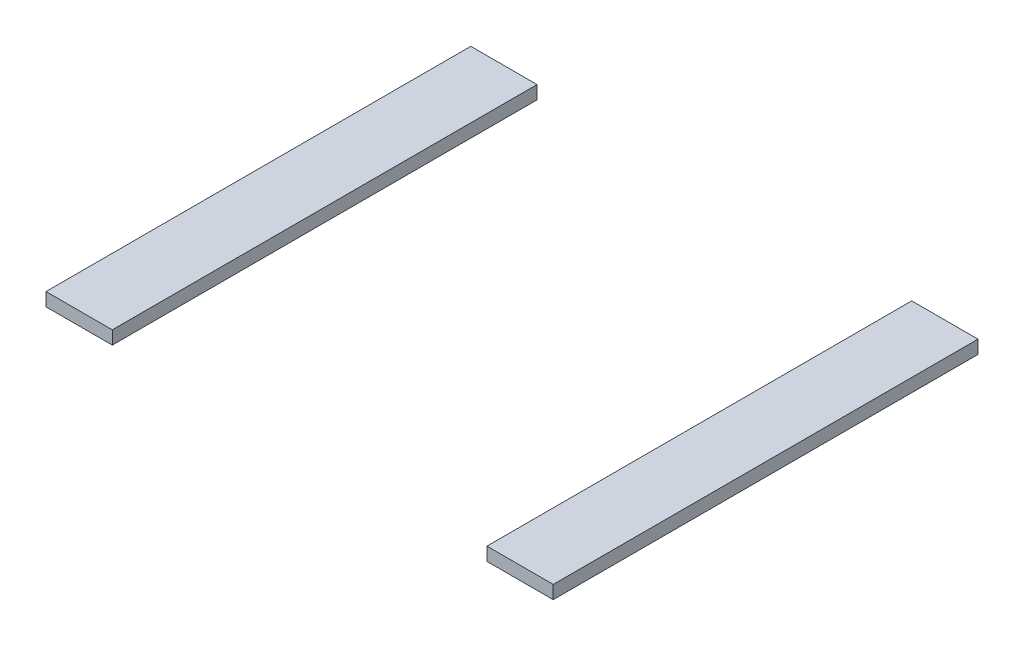
ISO-10303-21;
HEADER;
FILE_DESCRIPTION(('STEP AP214'),'2;1');
FILE_NAME('part.step','',(''),(''),'','','');
FILE_SCHEMA(('AUTOMOTIVE_DESIGN { 1 0 10303 214 1 1 1 1 }'));
ENDSEC;
DATA;
#1=APPLICATION_CONTEXT('core data for automotive mechanical design processes');
#2=APPLICATION_PROTOCOL_DEFINITION('international standard','automotive_design',2000,#1);
#3=PRODUCT_CONTEXT('',#1,'mechanical');
#4=PRODUCT('Part','Part','',(#3));
#5=PRODUCT_RELATED_PRODUCT_CATEGORY('part','',(#4));
#6=PRODUCT_DEFINITION_FORMATION('','',#4);
#7=PRODUCT_DEFINITION_CONTEXT('part definition',#1,'design');
#8=PRODUCT_DEFINITION('design','',#6,#7);
#9=PRODUCT_DEFINITION_SHAPE('','',#8);
#10=(LENGTH_UNIT() NAMED_UNIT(*) SI_UNIT(.MILLI.,.METRE.));
#11=(NAMED_UNIT(*) PLANE_ANGLE_UNIT() SI_UNIT($,.RADIAN.));
#12=(NAMED_UNIT(*) SI_UNIT($,.STERADIAN.) SOLID_ANGLE_UNIT());
#13=UNCERTAINTY_MEASURE_WITH_UNIT(LENGTH_MEASURE(1.E-05),#10,'distance_accuracy_value','');
#14=(GEOMETRIC_REPRESENTATION_CONTEXT(3) GLOBAL_UNCERTAINTY_ASSIGNED_CONTEXT((#13)) GLOBAL_UNIT_ASSIGNED_CONTEXT((#10,
#11,#12)) REPRESENTATION_CONTEXT('',''));
#15=CARTESIAN_POINT('',(0.,0.,0.));
#16=DIRECTION('',(0.,0.,1.));
#17=DIRECTION('',(1.,0.,0.));
#18=AXIS2_PLACEMENT_3D('',#15,#16,#17);
#19=CARTESIAN_POINT('',(0.,0.,0.));
#20=DIRECTION('',(0.,0.,-1.));
#21=DIRECTION('',(-1.,0.,0.));
#22=AXIS2_PLACEMENT_3D('',#19,#20,#21);
#23=PLANE('',#22);
#24=DIRECTION('',(0.,-1.,0.));
#25=VECTOR('',#24,1.);
#26=CARTESIAN_POINT('',(-274.804738153521,-24.0406605530446,0.));
#27=LINE('',#26,#25);
#28=CARTESIAN_POINT('',(-274.804738153521,-14.0406605530446,0.));
#29=VERTEX_POINT('',#28);
#30=CARTESIAN_POINT('',(-274.804738153521,-24.0406605530446,0.));
#31=VERTEX_POINT('',#30);
#32=EDGE_CURVE('E98',#29,#31,#27,.T.);
#33=ORIENTED_EDGE('',*,*,#32,.F.);
#34=DIRECTION('',(-1.,0.,0.));
#35=VECTOR('',#34,1.);
#36=CARTESIAN_POINT('',(-274.804738153521,-14.0406605530446,0.));
#37=LINE('',#36,#35);
#38=CARTESIAN_POINT('',(-224.804738153521,-14.0406605530446,0.));
#39=VERTEX_POINT('',#38);
#40=EDGE_CURVE('E109',#39,#29,#37,.T.);
#41=ORIENTED_EDGE('',*,*,#40,.F.);
#42=DIRECTION('',(0.,1.,0.));
#43=VECTOR('',#42,1.);
#44=CARTESIAN_POINT('',(-224.804738153521,-24.0406605530446,0.));
#45=LINE('',#44,#43);
#46=CARTESIAN_POINT('',(-224.804738153521,-24.0406605530446,0.));
#47=VERTEX_POINT('',#46);
#48=EDGE_CURVE('E100',#47,#39,#45,.T.);
#49=ORIENTED_EDGE('',*,*,#48,.F.);
#50=DIRECTION('',(1.,0.,0.));
#51=VECTOR('',#50,1.);
#52=CARTESIAN_POINT('',(-274.804738153521,-24.0406605530446,0.));
#53=LINE('',#52,#51);
#54=EDGE_CURVE('E90',#31,#47,#53,.T.);
#55=ORIENTED_EDGE('',*,*,#54,.F.);
#56=EDGE_LOOP('',(#33,#41,#49,#55));
#57=FACE_BOUND('',#56,.T.);
#58=ADVANCED_FACE('F48',(#57),#23,.T.);
#59=CARTESIAN_POINT('',(-274.804738153521,-14.0406605530446,371.390195135928));
#60=DIRECTION('',(0.,-1.,0.));
#61=DIRECTION('',(1.,0.,0.));
#62=AXIS2_PLACEMENT_3D('',#59,#60,#61);
#63=PLANE('',#62);
#64=DIRECTION('',(0.,0.,-1.));
#65=VECTOR('',#64,1.);
#66=CARTESIAN_POINT('',(-274.804738153521,-14.0406605530446,371.390195135928));
#67=LINE('',#66,#65);
#68=CARTESIAN_POINT('',(-274.804738153521,-14.0406605530446,320.4));
#69=VERTEX_POINT('',#68);
#70=EDGE_CURVE('E103',#69,#29,#67,.T.);
#71=ORIENTED_EDGE('',*,*,#70,.F.);
#72=DIRECTION('',(1.,0.,0.));
#73=VECTOR('',#72,1.);
#74=CARTESIAN_POINT('',(-274.804738153521,-14.0406605530446,320.4));
#75=LINE('',#74,#73);
#76=CARTESIAN_POINT('',(-224.804738153521,-14.0406605530446,320.4));
#77=VERTEX_POINT('',#76);
#78=EDGE_CURVE('E52',#69,#77,#75,.T.);
#79=ORIENTED_EDGE('',*,*,#78,.T.);
#80=DIRECTION('',(0.,0.,-1.));
#81=VECTOR('',#80,1.);
#82=CARTESIAN_POINT('',(-224.804738153521,-14.0406605530446,371.390195135928));
#83=LINE('',#82,#81);
#84=EDGE_CURVE('E112',#77,#39,#83,.T.);
#85=ORIENTED_EDGE('',*,*,#84,.T.);
#86=ORIENTED_EDGE('',*,*,#40,.T.);
#87=EDGE_LOOP('',(#71,#79,#85,#86));
#88=FACE_BOUND('',#87,.T.);
#89=ADVANCED_FACE('F121',(#88),#63,.F.);
#90=CARTESIAN_POINT('',(-224.804738153521,-24.0406605530446,371.390195135928));
#91=DIRECTION('',(-1.,0.,0.));
#92=DIRECTION('',(0.,0.,1.));
#93=AXIS2_PLACEMENT_3D('',#90,#91,#92);
#94=PLANE('',#93);
#95=ORIENTED_EDGE('',*,*,#84,.F.);
#96=DIRECTION('',(0.,-1.,0.));
#97=VECTOR('',#96,1.);
#98=CARTESIAN_POINT('',(-224.804738153521,-24.0406605530446,320.4));
#99=LINE('',#98,#97);
#100=CARTESIAN_POINT('',(-224.804738153521,-24.0406605530446,320.4));
#101=VERTEX_POINT('',#100);
#102=EDGE_CURVE('E118',#77,#101,#99,.T.);
#103=ORIENTED_EDGE('',*,*,#102,.T.);
#104=DIRECTION('',(0.,0.,-1.));
#105=VECTOR('',#104,1.);
#106=CARTESIAN_POINT('',(-224.804738153521,-24.0406605530446,371.390195135928));
#107=LINE('',#106,#105);
#108=EDGE_CURVE('E94',#101,#47,#107,.T.);
#109=ORIENTED_EDGE('',*,*,#108,.T.);
#110=ORIENTED_EDGE('',*,*,#48,.T.);
#111=EDGE_LOOP('',(#95,#103,#109,#110));
#112=FACE_BOUND('',#111,.T.);
#113=ADVANCED_FACE('F117',(#112),#94,.F.);
#114=CARTESIAN_POINT('',(-274.804738153521,-24.0406605530446,371.390195135928));
#115=DIRECTION('',(0.,1.,0.));
#116=DIRECTION('',(-1.,0.,0.));
#117=AXIS2_PLACEMENT_3D('',#114,#115,#116);
#118=PLANE('',#117);
#119=ORIENTED_EDGE('',*,*,#108,.F.);
#120=DIRECTION('',(-1.,0.,0.));
#121=VECTOR('',#120,1.);
#122=CARTESIAN_POINT('',(-274.804738153521,-24.0406605530446,320.4));
#123=LINE('',#122,#121);
#124=CARTESIAN_POINT('',(-274.804738153521,-24.0406605530446,320.4));
#125=VERTEX_POINT('',#124);
#126=EDGE_CURVE('E57',#101,#125,#123,.T.);
#127=ORIENTED_EDGE('',*,*,#126,.T.);
#128=DIRECTION('',(0.,0.,-1.));
#129=VECTOR('',#128,1.);
#130=CARTESIAN_POINT('',(-274.804738153521,-24.0406605530446,371.390195135928));
#131=LINE('',#130,#129);
#132=EDGE_CURVE('E87',#125,#31,#131,.T.);
#133=ORIENTED_EDGE('',*,*,#132,.T.);
#134=ORIENTED_EDGE('',*,*,#54,.T.);
#135=EDGE_LOOP('',(#119,#127,#133,#134));
#136=FACE_BOUND('',#135,.T.);
#137=ADVANCED_FACE('F89',(#136),#118,.F.);
#138=CARTESIAN_POINT('',(-274.804738153521,-24.0406605530446,371.390195135928));
#139=DIRECTION('',(1.,0.,0.));
#140=DIRECTION('',(0.,0.,-1.));
#141=AXIS2_PLACEMENT_3D('',#138,#139,#140);
#142=PLANE('',#141);
#143=ORIENTED_EDGE('',*,*,#132,.F.);
#144=DIRECTION('',(0.,1.,0.));
#145=VECTOR('',#144,1.);
#146=CARTESIAN_POINT('',(-274.804738153521,-24.0406605530446,320.4));
#147=LINE('',#146,#145);
#148=EDGE_CURVE('E12',#125,#69,#147,.T.);
#149=ORIENTED_EDGE('',*,*,#148,.T.);
#150=ORIENTED_EDGE('',*,*,#70,.T.);
#151=ORIENTED_EDGE('',*,*,#32,.T.);
#152=EDGE_LOOP('',(#143,#149,#150,#151));
#153=FACE_BOUND('',#152,.T.);
#154=ADVANCED_FACE('F50',(#153),#142,.F.);
#155=CARTESIAN_POINT('',(-363.355719139738,-44.0406605530447,320.4));
#156=DIRECTION('',(0.,0.,-1.));
#157=DIRECTION('',(0.,1.,0.));
#158=AXIS2_PLACEMENT_3D('',#155,#156,#157);
#159=PLANE('',#158);
#160=ORIENTED_EDGE('',*,*,#126,.F.);
#161=ORIENTED_EDGE('',*,*,#102,.F.);
#162=ORIENTED_EDGE('',*,*,#78,.F.);
#163=ORIENTED_EDGE('',*,*,#148,.F.);
#164=EDGE_LOOP('',(#160,#161,#162,#163));
#165=FACE_BOUND('',#164,.T.);
#166=ADVANCED_FACE('F135',(#165),#159,.F.);
#167=CLOSED_SHELL('',(#58,#89,#113,#137,#154,#166));
#168=MANIFOLD_SOLID_BREP('B2',#167);
#169=CARTESIAN_POINT('',(0.,0.,0.));
#170=DIRECTION('',(0.,0.,1.));
#171=DIRECTION('',(1.,0.,0.));
#172=AXIS2_PLACEMENT_3D('',#169,#170,#171);
#173=PLANE('',#172);
#174=DIRECTION('',(0.,1.,0.));
#175=VECTOR('',#174,1.);
#176=CARTESIAN_POINT('',(107.793299874045,-24.0406605530446,0.));
#177=LINE('',#176,#175);
#178=CARTESIAN_POINT('',(107.793299874045,-24.0406605530446,0.));
#179=VERTEX_POINT('',#178);
#180=CARTESIAN_POINT('',(107.793299874045,-14.0406605530446,0.));
#181=VERTEX_POINT('',#180);
#182=EDGE_CURVE('E232',#179,#181,#177,.T.);
#183=ORIENTED_EDGE('',*,*,#182,.F.);
#184=DIRECTION('',(1.,0.,0.));
#185=VECTOR('',#184,1.);
#186=CARTESIAN_POINT('',(107.793299874045,-24.0406605530446,0.));
#187=LINE('',#186,#185);
#188=CARTESIAN_POINT('',(57.7932998740446,-24.0406605530446,0.));
#189=VERTEX_POINT('',#188);
#190=EDGE_CURVE('E243',#189,#179,#187,.T.);
#191=ORIENTED_EDGE('',*,*,#190,.F.);
#192=DIRECTION('',(0.,-1.,0.));
#193=VECTOR('',#192,1.);
#194=CARTESIAN_POINT('',(57.7932998740446,-24.0406605530446,0.));
#195=LINE('',#194,#193);
#196=CARTESIAN_POINT('',(57.7932998740446,-14.0406605530446,0.));
#197=VERTEX_POINT('',#196);
#198=EDGE_CURVE('E234',#197,#189,#195,.T.);
#199=ORIENTED_EDGE('',*,*,#198,.F.);
#200=DIRECTION('',(-1.,0.,0.));
#201=VECTOR('',#200,1.);
#202=CARTESIAN_POINT('',(107.793299874045,-14.0406605530446,0.));
#203=LINE('',#202,#201);
#204=EDGE_CURVE('E224',#181,#197,#203,.T.);
#205=ORIENTED_EDGE('',*,*,#204,.F.);
#206=EDGE_LOOP('',(#183,#191,#199,#205));
#207=FACE_BOUND('',#206,.T.);
#208=ADVANCED_FACE('F182',(#207),#173,.F.);
#209=CARTESIAN_POINT('',(107.793299874045,-24.0406605530446,371.390195135928));
#210=DIRECTION('',(0.,1.,0.));
#211=DIRECTION('',(-1.,0.,0.));
#212=AXIS2_PLACEMENT_3D('',#209,#210,#211);
#213=PLANE('',#212);
#214=DIRECTION('',(0.,0.,-1.));
#215=VECTOR('',#214,1.);
#216=CARTESIAN_POINT('',(107.793299874045,-24.0406605530446,371.390195135928));
#217=LINE('',#216,#215);
#218=CARTESIAN_POINT('',(107.793299874045,-24.0406605530446,320.4));
#219=VERTEX_POINT('',#218);
#220=EDGE_CURVE('E237',#219,#179,#217,.T.);
#221=ORIENTED_EDGE('',*,*,#220,.F.);
#222=DIRECTION('',(-1.,0.,0.));
#223=VECTOR('',#222,1.);
#224=CARTESIAN_POINT('',(107.793299874045,-24.0406605530446,320.4));
#225=LINE('',#224,#223);
#226=CARTESIAN_POINT('',(57.7932998740446,-24.0406605530446,320.4));
#227=VERTEX_POINT('',#226);
#228=EDGE_CURVE('E186',#219,#227,#225,.T.);
#229=ORIENTED_EDGE('',*,*,#228,.T.);
#230=DIRECTION('',(0.,0.,-1.));
#231=VECTOR('',#230,1.);
#232=CARTESIAN_POINT('',(57.7932998740446,-24.0406605530446,371.390195135928));
#233=LINE('',#232,#231);
#234=EDGE_CURVE('E246',#227,#189,#233,.T.);
#235=ORIENTED_EDGE('',*,*,#234,.T.);
#236=ORIENTED_EDGE('',*,*,#190,.T.);
#237=EDGE_LOOP('',(#221,#229,#235,#236));
#238=FACE_BOUND('',#237,.T.);
#239=ADVANCED_FACE('F255',(#238),#213,.F.);
#240=CARTESIAN_POINT('',(57.7932998740446,-24.0406605530446,371.390195135928));
#241=DIRECTION('',(1.,0.,0.));
#242=DIRECTION('',(0.,1.,0.));
#243=AXIS2_PLACEMENT_3D('',#240,#241,#242);
#244=PLANE('',#243);
#245=ORIENTED_EDGE('',*,*,#234,.F.);
#246=DIRECTION('',(0.,1.,0.));
#247=VECTOR('',#246,1.);
#248=CARTESIAN_POINT('',(57.7932998740446,-24.0406605530446,320.4));
#249=LINE('',#248,#247);
#250=CARTESIAN_POINT('',(57.7932998740446,-14.0406605530446,320.4));
#251=VERTEX_POINT('',#250);
#252=EDGE_CURVE('E252',#227,#251,#249,.T.);
#253=ORIENTED_EDGE('',*,*,#252,.T.);
#254=DIRECTION('',(0.,0.,-1.));
#255=VECTOR('',#254,1.);
#256=CARTESIAN_POINT('',(57.7932998740446,-14.0406605530446,371.390195135928));
#257=LINE('',#256,#255);
#258=EDGE_CURVE('E228',#251,#197,#257,.T.);
#259=ORIENTED_EDGE('',*,*,#258,.T.);
#260=ORIENTED_EDGE('',*,*,#198,.T.);
#261=EDGE_LOOP('',(#245,#253,#259,#260));
#262=FACE_BOUND('',#261,.T.);
#263=ADVANCED_FACE('F251',(#262),#244,.F.);
#264=CARTESIAN_POINT('',(107.793299874045,-14.0406605530446,371.390195135928));
#265=DIRECTION('',(0.,-1.,0.));
#266=DIRECTION('',(1.,0.,0.));
#267=AXIS2_PLACEMENT_3D('',#264,#265,#266);
#268=PLANE('',#267);
#269=ORIENTED_EDGE('',*,*,#258,.F.);
#270=DIRECTION('',(1.,0.,0.));
#271=VECTOR('',#270,1.);
#272=CARTESIAN_POINT('',(107.793299874045,-14.0406605530446,320.4));
#273=LINE('',#272,#271);
#274=CARTESIAN_POINT('',(107.793299874045,-14.0406605530446,320.4));
#275=VERTEX_POINT('',#274);
#276=EDGE_CURVE('E191',#251,#275,#273,.T.);
#277=ORIENTED_EDGE('',*,*,#276,.T.);
#278=DIRECTION('',(0.,0.,-1.));
#279=VECTOR('',#278,1.);
#280=CARTESIAN_POINT('',(107.793299874045,-14.0406605530446,371.390195135928));
#281=LINE('',#280,#279);
#282=EDGE_CURVE('E221',#275,#181,#281,.T.);
#283=ORIENTED_EDGE('',*,*,#282,.T.);
#284=ORIENTED_EDGE('',*,*,#204,.T.);
#285=EDGE_LOOP('',(#269,#277,#283,#284));
#286=FACE_BOUND('',#285,.T.);
#287=ADVANCED_FACE('F223',(#286),#268,.F.);
#288=CARTESIAN_POINT('',(107.793299874045,-24.0406605530446,371.390195135928));
#289=DIRECTION('',(-1.,0.,0.));
#290=DIRECTION('',(0.,0.,1.));
#291=AXIS2_PLACEMENT_3D('',#288,#289,#290);
#292=PLANE('',#291);
#293=ORIENTED_EDGE('',*,*,#282,.F.);
#294=DIRECTION('',(0.,-1.,0.));
#295=VECTOR('',#294,1.);
#296=CARTESIAN_POINT('',(107.793299874045,-24.0406605530446,320.4));
#297=LINE('',#296,#295);
#298=EDGE_CURVE('E46',#275,#219,#297,.T.);
#299=ORIENTED_EDGE('',*,*,#298,.T.);
#300=ORIENTED_EDGE('',*,*,#220,.T.);
#301=ORIENTED_EDGE('',*,*,#182,.T.);
#302=EDGE_LOOP('',(#293,#299,#300,#301));
#303=FACE_BOUND('',#302,.T.);
#304=ADVANCED_FACE('F184',(#303),#292,.F.);
#305=CARTESIAN_POINT('',(-363.355719139738,-44.0406605530447,320.4));
#306=DIRECTION('',(0.,0.,-1.));
#307=DIRECTION('',(0.,1.,0.));
#308=AXIS2_PLACEMENT_3D('',#305,#306,#307);
#309=PLANE('',#308);
#310=ORIENTED_EDGE('',*,*,#276,.F.);
#311=ORIENTED_EDGE('',*,*,#252,.F.);
#312=ORIENTED_EDGE('',*,*,#228,.F.);
#313=ORIENTED_EDGE('',*,*,#298,.F.);
#314=EDGE_LOOP('',(#310,#311,#312,#313));
#315=FACE_BOUND('',#314,.T.);
#316=ADVANCED_FACE('F269',(#315),#309,.F.);
#317=CLOSED_SHELL('',(#208,#239,#263,#287,#304,#316));
#318=MANIFOLD_SOLID_BREP('B6',#317);
#319=ADVANCED_BREP_SHAPE_REPRESENTATION('',(#18,#168,#318),#14);
#320=SHAPE_DEFINITION_REPRESENTATION(#9,#319);
ENDSEC;
END-ISO-10303-21;
